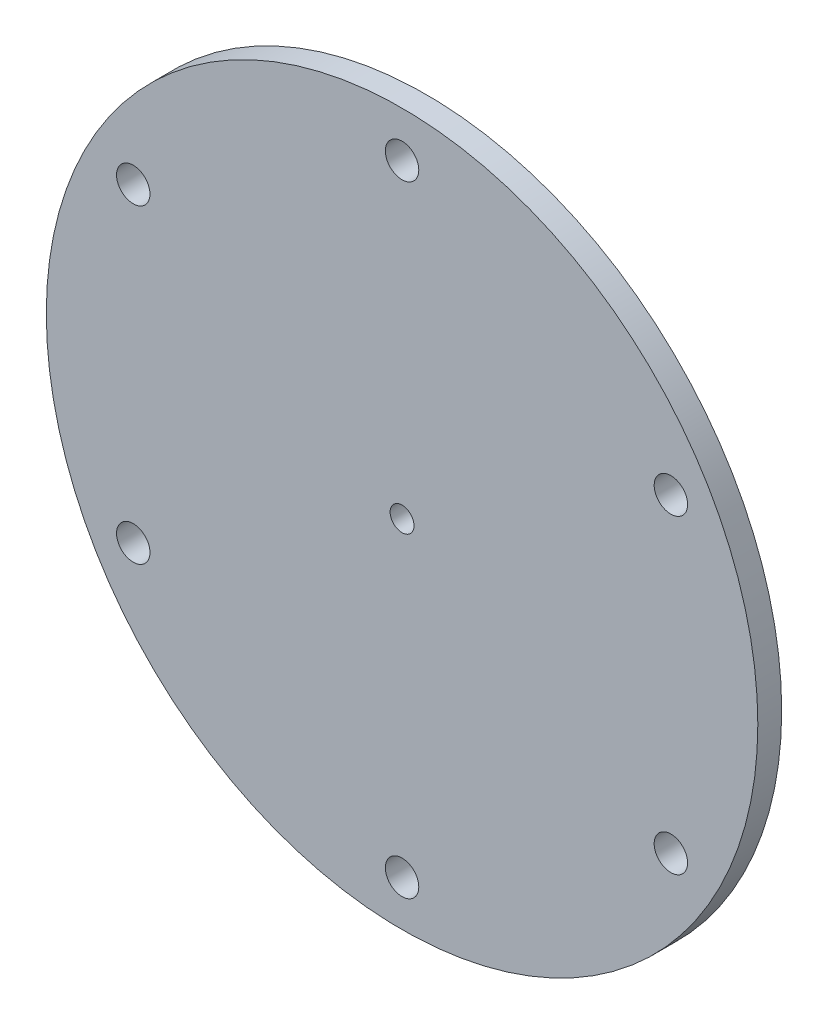
ISO-10303-21;
HEADER;
FILE_DESCRIPTION(('STEP AP214'),'2;1');
FILE_NAME('part.step','',(''),(''),'','','');
FILE_SCHEMA(('AUTOMOTIVE_DESIGN { 1 0 10303 214 1 1 1 1 }'));
ENDSEC;
DATA;
#1=APPLICATION_CONTEXT('core data for automotive mechanical design processes');
#2=APPLICATION_PROTOCOL_DEFINITION('international standard','automotive_design',2000,#1);
#3=PRODUCT_CONTEXT('',#1,'mechanical');
#4=PRODUCT('Part','Part','',(#3));
#5=PRODUCT_RELATED_PRODUCT_CATEGORY('part','',(#4));
#6=PRODUCT_DEFINITION_FORMATION('','',#4);
#7=PRODUCT_DEFINITION_CONTEXT('part definition',#1,'design');
#8=PRODUCT_DEFINITION('design','',#6,#7);
#9=PRODUCT_DEFINITION_SHAPE('','',#8);
#10=(LENGTH_UNIT() NAMED_UNIT(*) SI_UNIT(.MILLI.,.METRE.));
#11=(NAMED_UNIT(*) PLANE_ANGLE_UNIT() SI_UNIT($,.RADIAN.));
#12=(NAMED_UNIT(*) SI_UNIT($,.STERADIAN.) SOLID_ANGLE_UNIT());
#13=UNCERTAINTY_MEASURE_WITH_UNIT(LENGTH_MEASURE(1.E-05),#10,'distance_accuracy_value','');
#14=(GEOMETRIC_REPRESENTATION_CONTEXT(3) GLOBAL_UNCERTAINTY_ASSIGNED_CONTEXT((#13)) GLOBAL_UNIT_ASSIGNED_CONTEXT((#10,
#11,#12)) REPRESENTATION_CONTEXT('',''));
#15=CARTESIAN_POINT('',(0.,0.,0.));
#16=DIRECTION('',(0.,0.,1.));
#17=DIRECTION('',(1.,0.,0.));
#18=AXIS2_PLACEMENT_3D('',#15,#16,#17);
#19=CARTESIAN_POINT('',(0.,0.,3.));
#20=DIRECTION('',(0.,0.,-1.));
#21=DIRECTION('',(-1.,0.,0.));
#22=AXIS2_PLACEMENT_3D('',#19,#20,#21);
#23=CYLINDRICAL_SURFACE('',#22,44.7);
#24=CARTESIAN_POINT('',(0.,0.,3.));
#25=DIRECTION('',(0.,0.,1.));
#26=DIRECTION('',(1.,0.,0.));
#27=AXIS2_PLACEMENT_3D('',#24,#25,#26);
#28=CIRCLE('',#27,44.7);
#29=CARTESIAN_POINT('',(44.7,0.,3.));
#30=VERTEX_POINT('',#29);
#31=EDGE_CURVE('E10',#30,#30,#28,.T.);
#32=ORIENTED_EDGE('',*,*,#31,.F.);
#33=EDGE_LOOP('',(#32));
#34=FACE_BOUND('',#33,.T.);
#35=CARTESIAN_POINT('',(0.,0.,0.));
#36=DIRECTION('',(0.,0.,1.));
#37=DIRECTION('',(1.,0.,0.));
#38=AXIS2_PLACEMENT_3D('',#35,#36,#37);
#39=CIRCLE('',#38,44.7);
#40=CARTESIAN_POINT('',(44.7,0.,0.));
#41=VERTEX_POINT('',#40);
#42=EDGE_CURVE('E39',#41,#41,#39,.T.);
#43=ORIENTED_EDGE('',*,*,#42,.T.);
#44=EDGE_LOOP('',(#43));
#45=FACE_BOUND('',#44,.T.);
#46=ADVANCED_FACE('F36',(#34,#45),#23,.T.);
#47=CARTESIAN_POINT('',(0.,0.,3.));
#48=DIRECTION('',(0.,0.,1.));
#49=DIRECTION('',(1.,0.,0.));
#50=AXIS2_PLACEMENT_3D('',#47,#48,#49);
#51=PLANE('',#50);
#52=CARTESIAN_POINT('',(-33.7749907475929,19.5000000000004,3.));
#53=DIRECTION('',(0.,0.,1.));
#54=DIRECTION('',(1.,0.,0.));
#55=AXIS2_PLACEMENT_3D('',#52,#53,#54);
#56=CIRCLE('',#55,2.1);
#57=CARTESIAN_POINT('',(-31.6749907475929,19.5000000000004,3.));
#58=VERTEX_POINT('',#57);
#59=EDGE_CURVE('E59',#58,#58,#56,.F.);
#60=ORIENTED_EDGE('',*,*,#59,.T.);
#61=EDGE_LOOP('',(#60));
#62=FACE_BOUND('',#61,.T.);
#63=CARTESIAN_POINT('',(-33.7749907475933,-19.4999999999997,3.));
#64=DIRECTION('',(0.,0.,1.));
#65=DIRECTION('',(1.,0.,0.));
#66=AXIS2_PLACEMENT_3D('',#63,#64,#65);
#67=CIRCLE('',#66,2.1);
#68=CARTESIAN_POINT('',(-31.6749907475933,-19.4999999999997,3.));
#69=VERTEX_POINT('',#68);
#70=EDGE_CURVE('E62',#69,#69,#67,.F.);
#71=ORIENTED_EDGE('',*,*,#70,.T.);
#72=EDGE_LOOP('',(#71));
#73=FACE_BOUND('',#72,.T.);
#74=CARTESIAN_POINT('',(0.,-39.,3.));
#75=DIRECTION('',(0.,0.,1.));
#76=DIRECTION('',(1.,0.,0.));
#77=AXIS2_PLACEMENT_3D('',#74,#75,#76);
#78=CIRCLE('',#77,2.1);
#79=CARTESIAN_POINT('',(2.1,-39.,3.));
#80=VERTEX_POINT('',#79);
#81=EDGE_CURVE('E65',#80,#80,#78,.F.);
#82=ORIENTED_EDGE('',*,*,#81,.T.);
#83=EDGE_LOOP('',(#82));
#84=FACE_BOUND('',#83,.T.);
#85=CARTESIAN_POINT('',(33.774990747593,-19.5000000000002,3.));
#86=DIRECTION('',(0.,0.,1.));
#87=DIRECTION('',(1.,0.,0.));
#88=AXIS2_PLACEMENT_3D('',#85,#86,#87);
#89=CIRCLE('',#88,2.1);
#90=CARTESIAN_POINT('',(35.874990747593,-19.5000000000002,3.));
#91=VERTEX_POINT('',#90);
#92=EDGE_CURVE('E68',#91,#91,#89,.F.);
#93=ORIENTED_EDGE('',*,*,#92,.T.);
#94=EDGE_LOOP('',(#93));
#95=FACE_BOUND('',#94,.T.);
#96=CARTESIAN_POINT('',(33.7749907475932,19.4999999999999,3.));
#97=DIRECTION('',(0.,0.,1.));
#98=DIRECTION('',(1.,0.,0.));
#99=AXIS2_PLACEMENT_3D('',#96,#97,#98);
#100=CIRCLE('',#99,2.1);
#101=CARTESIAN_POINT('',(35.8749907475932,19.4999999999999,3.));
#102=VERTEX_POINT('',#101);
#103=EDGE_CURVE('E71',#102,#102,#100,.F.);
#104=ORIENTED_EDGE('',*,*,#103,.T.);
#105=EDGE_LOOP('',(#104));
#106=FACE_BOUND('',#105,.T.);
#107=CARTESIAN_POINT('',(0.,39.,3.));
#108=DIRECTION('',(0.,0.,1.));
#109=DIRECTION('',(1.,0.,0.));
#110=AXIS2_PLACEMENT_3D('',#107,#108,#109);
#111=CIRCLE('',#110,2.1);
#112=CARTESIAN_POINT('',(2.1,39.,3.));
#113=VERTEX_POINT('',#112);
#114=EDGE_CURVE('E53',#113,#113,#111,.F.);
#115=ORIENTED_EDGE('',*,*,#114,.T.);
#116=EDGE_LOOP('',(#115));
#117=FACE_BOUND('',#116,.T.);
#118=CARTESIAN_POINT('',(0.,0.,3.));
#119=DIRECTION('',(0.,0.,1.));
#120=DIRECTION('',(1.,0.,0.));
#121=AXIS2_PLACEMENT_3D('',#118,#119,#120);
#122=CIRCLE('',#121,1.5);
#123=CARTESIAN_POINT('',(1.5,0.,3.));
#124=VERTEX_POINT('',#123);
#125=EDGE_CURVE('E46',#124,#124,#122,.F.);
#126=ORIENTED_EDGE('',*,*,#125,.T.);
#127=EDGE_LOOP('',(#126));
#128=FACE_BOUND('',#127,.T.);
#129=ORIENTED_EDGE('',*,*,#31,.T.);
#130=EDGE_LOOP('',(#129));
#131=FACE_BOUND('',#130,.T.);
#132=ADVANCED_FACE('F111',(#62,#73,#84,#95,#106,#117,#128,#131),#51,.T.);
#133=CARTESIAN_POINT('',(0.,0.,0.));
#134=DIRECTION('',(0.,0.,1.));
#135=DIRECTION('',(1.,0.,0.));
#136=AXIS2_PLACEMENT_3D('',#133,#134,#135);
#137=PLANE('',#136);
#138=CARTESIAN_POINT('',(-33.7749907475929,19.5000000000004,0.));
#139=DIRECTION('',(0.,0.,1.));
#140=DIRECTION('',(0.50000000000001,0.866025403784433,0.));
#141=AXIS2_PLACEMENT_3D('',#138,#139,#140);
#142=CIRCLE('',#141,2.1);
#143=CARTESIAN_POINT('',(-32.7249907475929,21.3186533479477,0.));
#144=VERTEX_POINT('',#143);
#145=EDGE_CURVE('E78',#144,#144,#142,.T.);
#146=ORIENTED_EDGE('',*,*,#145,.T.);
#147=EDGE_LOOP('',(#146));
#148=FACE_BOUND('',#147,.T.);
#149=CARTESIAN_POINT('',(-33.7749907475933,-19.4999999999997,0.));
#150=DIRECTION('',(0.,0.,1.));
#151=DIRECTION('',(-0.499999999999992,0.866025403784443,0.));
#152=AXIS2_PLACEMENT_3D('',#149,#150,#151);
#153=CIRCLE('',#152,2.1);
#154=CARTESIAN_POINT('',(-34.8249907475933,-17.6813466520524,0.));
#155=VERTEX_POINT('',#154);
#156=EDGE_CURVE('E81',#155,#155,#153,.T.);
#157=ORIENTED_EDGE('',*,*,#156,.T.);
#158=EDGE_LOOP('',(#157));
#159=FACE_BOUND('',#158,.T.);
#160=CARTESIAN_POINT('',(0.,-39.,0.));
#161=DIRECTION('',(0.,0.,1.));
#162=DIRECTION('',(-1.,0.,0.));
#163=AXIS2_PLACEMENT_3D('',#160,#161,#162);
#164=CIRCLE('',#163,2.1);
#165=CARTESIAN_POINT('',(-2.1,-39.,0.));
#166=VERTEX_POINT('',#165);
#167=EDGE_CURVE('E84',#166,#166,#164,.T.);
#168=ORIENTED_EDGE('',*,*,#167,.T.);
#169=EDGE_LOOP('',(#168));
#170=FACE_BOUND('',#169,.T.);
#171=CARTESIAN_POINT('',(33.774990747593,-19.5000000000002,0.));
#172=DIRECTION('',(0.,0.,1.));
#173=DIRECTION('',(-0.500000000000004,-0.866025403784436,0.));
#174=AXIS2_PLACEMENT_3D('',#171,#172,#173);
#175=CIRCLE('',#174,2.1);
#176=CARTESIAN_POINT('',(32.724990747593,-21.3186533479475,0.));
#177=VERTEX_POINT('',#176);
#178=EDGE_CURVE('E77',#177,#177,#175,.T.);
#179=ORIENTED_EDGE('',*,*,#178,.T.);
#180=EDGE_LOOP('',(#179));
#181=FACE_BOUND('',#180,.T.);
#182=CARTESIAN_POINT('',(33.7749907475932,19.4999999999999,0.));
#183=DIRECTION('',(0.,0.,1.));
#184=DIRECTION('',(0.499999999999998,-0.86602540378444,0.));
#185=AXIS2_PLACEMENT_3D('',#182,#183,#184);
#186=CIRCLE('',#185,2.1);
#187=CARTESIAN_POINT('',(34.8249907475931,17.6813466520526,0.));
#188=VERTEX_POINT('',#187);
#189=EDGE_CURVE('E74',#188,#188,#186,.T.);
#190=ORIENTED_EDGE('',*,*,#189,.T.);
#191=EDGE_LOOP('',(#190));
#192=FACE_BOUND('',#191,.T.);
#193=CARTESIAN_POINT('',(0.,39.,0.));
#194=DIRECTION('',(0.,0.,1.));
#195=DIRECTION('',(1.,0.,0.));
#196=AXIS2_PLACEMENT_3D('',#193,#194,#195);
#197=CIRCLE('',#196,2.1);
#198=CARTESIAN_POINT('',(2.1,39.,0.));
#199=VERTEX_POINT('',#198);
#200=EDGE_CURVE('E56',#199,#199,#197,.T.);
#201=ORIENTED_EDGE('',*,*,#200,.T.);
#202=EDGE_LOOP('',(#201));
#203=FACE_BOUND('',#202,.T.);
#204=CARTESIAN_POINT('',(0.,0.,0.));
#205=DIRECTION('',(0.,0.,1.));
#206=DIRECTION('',(1.,0.,0.));
#207=AXIS2_PLACEMENT_3D('',#204,#205,#206);
#208=CIRCLE('',#207,1.5);
#209=CARTESIAN_POINT('',(1.5,0.,0.));
#210=VERTEX_POINT('',#209);
#211=EDGE_CURVE('E50',#210,#210,#208,.T.);
#212=ORIENTED_EDGE('',*,*,#211,.T.);
#213=EDGE_LOOP('',(#212));
#214=FACE_BOUND('',#213,.T.);
#215=ORIENTED_EDGE('',*,*,#42,.F.);
#216=EDGE_LOOP('',(#215));
#217=FACE_BOUND('',#216,.T.);
#218=ADVANCED_FACE('F90',(#148,#159,#170,#181,#192,#203,#214,#217),#137,.F.);
#219=CARTESIAN_POINT('',(0.,0.,73.5));
#220=DIRECTION('',(0.,0.,-1.));
#221=DIRECTION('',(-1.,0.,0.));
#222=AXIS2_PLACEMENT_3D('',#219,#220,#221);
#223=CYLINDRICAL_SURFACE('',#222,1.5);
#224=ORIENTED_EDGE('',*,*,#125,.F.);
#225=EDGE_LOOP('',(#224));
#226=FACE_BOUND('',#225,.T.);
#227=ORIENTED_EDGE('',*,*,#211,.F.);
#228=EDGE_LOOP('',(#227));
#229=FACE_BOUND('',#228,.T.);
#230=ADVANCED_FACE('F122',(#226,#229),#223,.F.);
#231=CARTESIAN_POINT('',(0.,39.,42.));
#232=DIRECTION('',(0.,0.,-1.));
#233=DIRECTION('',(-1.,0.,0.));
#234=AXIS2_PLACEMENT_3D('',#231,#232,#233);
#235=CYLINDRICAL_SURFACE('',#234,2.1);
#236=ORIENTED_EDGE('',*,*,#114,.F.);
#237=EDGE_LOOP('',(#236));
#238=FACE_BOUND('',#237,.T.);
#239=ORIENTED_EDGE('',*,*,#200,.F.);
#240=EDGE_LOOP('',(#239));
#241=FACE_BOUND('',#240,.T.);
#242=ADVANCED_FACE('F106',(#238,#241),#235,.F.);
#243=CARTESIAN_POINT('',(33.7749907475932,19.4999999999999,42.));
#244=DIRECTION('',(0.,0.,-1.));
#245=DIRECTION('',(-1.,0.,0.));
#246=AXIS2_PLACEMENT_3D('',#243,#244,#245);
#247=CYLINDRICAL_SURFACE('',#246,2.1);
#248=ORIENTED_EDGE('',*,*,#103,.F.);
#249=EDGE_LOOP('',(#248));
#250=FACE_BOUND('',#249,.T.);
#251=ORIENTED_EDGE('',*,*,#189,.F.);
#252=EDGE_LOOP('',(#251));
#253=FACE_BOUND('',#252,.T.);
#254=ADVANCED_FACE('F96',(#250,#253),#247,.F.);
#255=CARTESIAN_POINT('',(33.774990747593,-19.5000000000002,42.));
#256=DIRECTION('',(0.,0.,-1.));
#257=DIRECTION('',(-1.,0.,0.));
#258=AXIS2_PLACEMENT_3D('',#255,#256,#257);
#259=CYLINDRICAL_SURFACE('',#258,2.1);
#260=ORIENTED_EDGE('',*,*,#92,.F.);
#261=EDGE_LOOP('',(#260));
#262=FACE_BOUND('',#261,.T.);
#263=ORIENTED_EDGE('',*,*,#178,.F.);
#264=EDGE_LOOP('',(#263));
#265=FACE_BOUND('',#264,.T.);
#266=ADVANCED_FACE('F93',(#262,#265),#259,.F.);
#267=CARTESIAN_POINT('',(0.,-39.,42.));
#268=DIRECTION('',(0.,0.,-1.));
#269=DIRECTION('',(-1.,0.,0.));
#270=AXIS2_PLACEMENT_3D('',#267,#268,#269);
#271=CYLINDRICAL_SURFACE('',#270,2.1);
#272=ORIENTED_EDGE('',*,*,#81,.F.);
#273=EDGE_LOOP('',(#272));
#274=FACE_BOUND('',#273,.T.);
#275=ORIENTED_EDGE('',*,*,#167,.F.);
#276=EDGE_LOOP('',(#275));
#277=FACE_BOUND('',#276,.T.);
#278=ADVANCED_FACE('F95',(#274,#277),#271,.F.);
#279=CARTESIAN_POINT('',(-33.7749907475933,-19.4999999999997,42.));
#280=DIRECTION('',(0.,0.,-1.));
#281=DIRECTION('',(-1.,0.,0.));
#282=AXIS2_PLACEMENT_3D('',#279,#280,#281);
#283=CYLINDRICAL_SURFACE('',#282,2.1);
#284=ORIENTED_EDGE('',*,*,#70,.F.);
#285=EDGE_LOOP('',(#284));
#286=FACE_BOUND('',#285,.T.);
#287=ORIENTED_EDGE('',*,*,#156,.F.);
#288=EDGE_LOOP('',(#287));
#289=FACE_BOUND('',#288,.T.);
#290=ADVANCED_FACE('F103',(#286,#289),#283,.F.);
#291=CARTESIAN_POINT('',(-33.7749907475929,19.5000000000004,42.));
#292=DIRECTION('',(0.,0.,-1.));
#293=DIRECTION('',(-1.,0.,0.));
#294=AXIS2_PLACEMENT_3D('',#291,#292,#293);
#295=CYLINDRICAL_SURFACE('',#294,2.1);
#296=ORIENTED_EDGE('',*,*,#59,.F.);
#297=EDGE_LOOP('',(#296));
#298=FACE_BOUND('',#297,.T.);
#299=ORIENTED_EDGE('',*,*,#145,.F.);
#300=EDGE_LOOP('',(#299));
#301=FACE_BOUND('',#300,.T.);
#302=ADVANCED_FACE('F134',(#298,#301),#295,.F.);
#303=CLOSED_SHELL('',(#46,#132,#218,#230,#242,#254,#266,#278,#290,#302));
#304=MANIFOLD_SOLID_BREP('B2',#303);
#305=ADVANCED_BREP_SHAPE_REPRESENTATION('',(#18,#304),#14);
#306=SHAPE_DEFINITION_REPRESENTATION(#9,#305);
ENDSEC;
END-ISO-10303-21;
